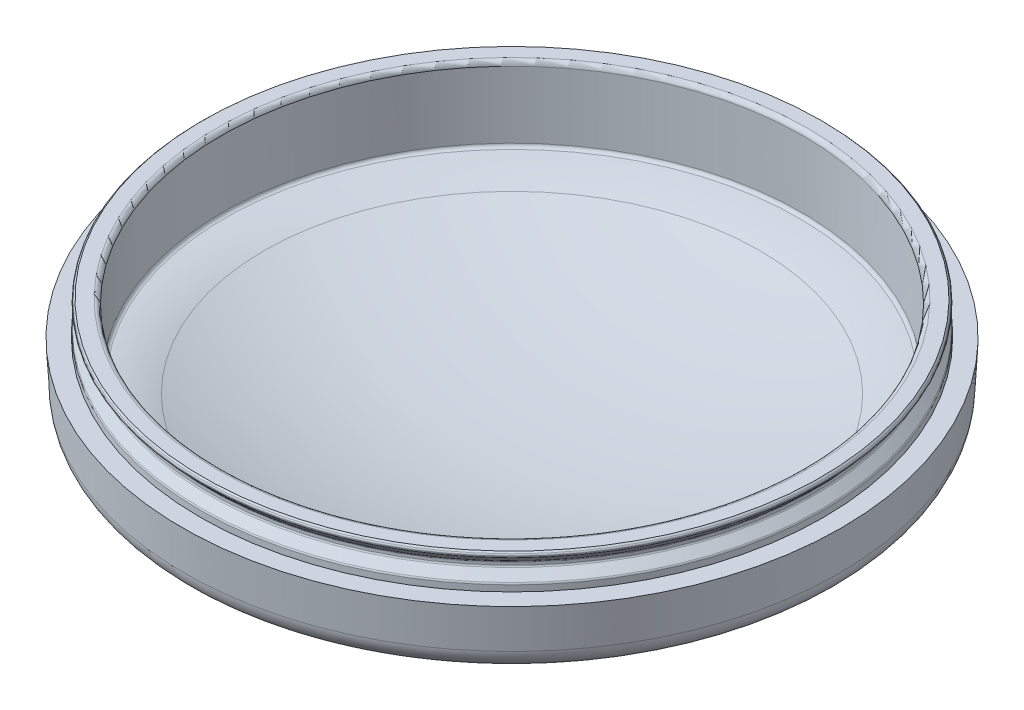
ISO-10303-21;
HEADER;
FILE_DESCRIPTION(('STEP AP214'),'2;1');
FILE_NAME('part.step','',(''),(''),'','','');
FILE_SCHEMA(('AUTOMOTIVE_DESIGN { 1 0 10303 214 1 1 1 1 }'));
ENDSEC;
DATA;
#1=APPLICATION_CONTEXT('core data for automotive mechanical design processes');
#2=APPLICATION_PROTOCOL_DEFINITION('international standard','automotive_design',2000,#1);
#3=PRODUCT_CONTEXT('',#1,'mechanical');
#4=PRODUCT('Part','Part','',(#3));
#5=PRODUCT_RELATED_PRODUCT_CATEGORY('part','',(#4));
#6=PRODUCT_DEFINITION_FORMATION('','',#4);
#7=PRODUCT_DEFINITION_CONTEXT('part definition',#1,'design');
#8=PRODUCT_DEFINITION('design','',#6,#7);
#9=PRODUCT_DEFINITION_SHAPE('','',#8);
#10=(LENGTH_UNIT() NAMED_UNIT(*) SI_UNIT(.MILLI.,.METRE.));
#11=(NAMED_UNIT(*) PLANE_ANGLE_UNIT() SI_UNIT($,.RADIAN.));
#12=(NAMED_UNIT(*) SI_UNIT($,.STERADIAN.) SOLID_ANGLE_UNIT());
#13=UNCERTAINTY_MEASURE_WITH_UNIT(LENGTH_MEASURE(1.E-05),#10,'distance_accuracy_value','');
#14=(GEOMETRIC_REPRESENTATION_CONTEXT(3) GLOBAL_UNCERTAINTY_ASSIGNED_CONTEXT((#13)) GLOBAL_UNIT_ASSIGNED_CONTEXT((#10,
#11,#12)) REPRESENTATION_CONTEXT('',''));
#15=CARTESIAN_POINT('',(0.,0.,0.));
#16=DIRECTION('',(0.,0.,1.));
#17=DIRECTION('',(1.,0.,0.));
#18=AXIS2_PLACEMENT_3D('',#15,#16,#17);
#19=CARTESIAN_POINT('',(0.,0.,0.));
#20=DIRECTION('',(0.,-1.,0.));
#21=DIRECTION('',(1.,0.,0.));
#22=AXIS2_PLACEMENT_3D('',#19,#20,#21);
#23=PLANE('',#22);
#24=CARTESIAN_POINT('',(0.,0.,0.));
#25=DIRECTION('',(0.,-1.,0.));
#26=DIRECTION('',(1.,0.,0.));
#27=AXIS2_PLACEMENT_3D('',#24,#25,#26);
#28=CIRCLE('',#27,13.9150898701436);
#29=CARTESIAN_POINT('',(13.9150898701436,0.,0.));
#30=VERTEX_POINT('',#29);
#31=EDGE_CURVE('E81',#30,#30,#28,.F.);
#32=ORIENTED_EDGE('',*,*,#31,.F.);
#33=EDGE_LOOP('',(#32));
#34=FACE_BOUND('',#33,.T.);
#35=CARTESIAN_POINT('',(0.,0.,0.));
#36=DIRECTION('',(0.,-1.,0.));
#37=DIRECTION('',(1.,0.,0.));
#38=AXIS2_PLACEMENT_3D('',#35,#36,#37);
#39=CIRCLE('',#38,14.71721203);
#40=CARTESIAN_POINT('',(14.71721203,0.,0.));
#41=VERTEX_POINT('',#40);
#42=EDGE_CURVE('E84',#41,#41,#39,.T.);
#43=ORIENTED_EDGE('',*,*,#42,.F.);
#44=EDGE_LOOP('',(#43));
#45=FACE_BOUND('',#44,.T.);
#46=ADVANCED_FACE('F31',(#34,#45),#23,.F.);
#47=CARTESIAN_POINT('',(0.,0.,0.));
#48=DIRECTION('',(0.,1.,0.));
#49=DIRECTION('',(-1.,0.,0.));
#50=AXIS2_PLACEMENT_3D('',#47,#48,#49);
#51=CONICAL_SURFACE('',#50,14.71721203,0.0523598775598355);
#52=CARTESIAN_POINT('',(0.,-1.80397857768988,0.));
#53=DIRECTION('',(0.,-1.,0.));
#54=DIRECTION('',(1.,0.,0.));
#55=AXIS2_PLACEMENT_3D('',#52,#53,#54);
#56=CIRCLE('',#55,14.6226695188691);
#57=CARTESIAN_POINT('',(14.6226695188691,-1.80397857768989,0.));
#58=VERTEX_POINT('',#57);
#59=EDGE_CURVE('E87',#58,#58,#56,.T.);
#60=ORIENTED_EDGE('',*,*,#59,.F.);
#61=EDGE_LOOP('',(#60));
#62=FACE_BOUND('',#61,.T.);
#63=ORIENTED_EDGE('',*,*,#42,.T.);
#64=EDGE_LOOP('',(#63));
#65=FACE_BOUND('',#64,.T.);
#66=ADVANCED_FACE('F120',(#62,#65),#51,.T.);
#67=CARTESIAN_POINT('',(0.,-1.75164262156415,0.));
#68=DIRECTION('',(0.,-1.,0.));
#69=DIRECTION('',(1.,0.,0.));
#70=AXIS2_PLACEMENT_3D('',#67,#68,#69);
#71=TOROIDAL_SURFACE('',#70,13.6240399863513,0.999999997760164);
#72=CARTESIAN_POINT('',(0.,-2.75140795942134,0.));
#73=DIRECTION('',(0.,-1.,0.));
#74=DIRECTION('',(1.,0.,0.));
#75=AXIS2_PLACEMENT_3D('',#72,#73,#74);
#76=CIRCLE('',#75,13.6023774671155);
#77=CARTESIAN_POINT('',(13.6023774671155,-2.75140795942135,0.));
#78=VERTEX_POINT('',#77);
#79=EDGE_CURVE('E90',#78,#78,#76,.T.);
#80=ORIENTED_EDGE('',*,*,#79,.F.);
#81=EDGE_LOOP('',(#80));
#82=FACE_BOUND('',#81,.T.);
#83=ORIENTED_EDGE('',*,*,#59,.T.);
#84=EDGE_LOOP('',(#83));
#85=FACE_BOUND('',#84,.T.);
#86=ADVANCED_FACE('F126',(#82,#85),#71,.T.);
#87=CARTESIAN_POINT('',(0.,-8.75000000000029,0.));
#88=DIRECTION('',(0.,-1.,0.));
#89=DIRECTION('',(1.,0.,0.));
#90=AXIS2_PLACEMENT_3D('',#87,#88,#89);
#91=TOROIDAL_SURFACE('',#90,13.4724023514095,5.99999999999997);
#92=CARTESIAN_POINT('',(0.,-3.11381974614816,0.));
#93=DIRECTION('',(0.,-1.,0.));
#94=DIRECTION('',(1.,0.,0.));
#95=AXIS2_PLACEMENT_3D('',#92,#93,#94);
#96=CIRCLE('',#95,11.414862036838);
#97=CARTESIAN_POINT('',(11.414862036838,-3.11381974614817,0.));
#98=VERTEX_POINT('',#97);
#99=EDGE_CURVE('E93',#98,#98,#96,.T.);
#100=ORIENTED_EDGE('',*,*,#99,.F.);
#101=EDGE_LOOP('',(#100));
#102=FACE_BOUND('',#101,.T.);
#103=ORIENTED_EDGE('',*,*,#79,.T.);
#104=EDGE_LOOP('',(#103));
#105=FACE_BOUND('',#104,.T.);
#106=ADVANCED_FACE('F205',(#102,#105),#91,.F.);
#107=CARTESIAN_POINT('',(0.,28.1546903077457,0.));
#108=DIRECTION('',(0.,-1.,0.));
#109=DIRECTION('',(-1.,0.,0.));
#110=AXIS2_PLACEMENT_3D('',#107,#108,#109);
#111=SPHERICAL_SURFACE('',#110,33.2869162932001);
#112=ORIENTED_EDGE('',*,*,#99,.T.);
#113=EDGE_LOOP('',(#112));
#114=FACE_BOUND('',#113,.T.);
#115=ADVANCED_FACE('F116',(#114),#111,.T.);
#116=CARTESIAN_POINT('',(0.,0.309804838267562,0.));
#117=DIRECTION('',(0.,-1.,0.));
#118=DIRECTION('',(0.,0.,-1.));
#119=AXIS2_PLACEMENT_3D('',#116,#117,#118);
#120=CONICAL_SURFACE('',#119,13.9096822065765,0.0174532925199385);
#121=CARTESIAN_POINT('',(0.,0.268389790703316,0.));
#122=DIRECTION('',(0.,1.,0.));
#123=DIRECTION('',(0.,0.,1.));
#124=AXIS2_PLACEMENT_3D('',#121,#122,#123);
#125=CIRCLE('',#124,13.9104051089208);
#126=CARTESIAN_POINT('',(0.,0.268389790703316,13.9104051089208));
#127=VERTEX_POINT('',#126);
#128=EDGE_CURVE('E10',#127,#127,#125,.F.);
#129=ORIENTED_EDGE('',*,*,#128,.T.);
#130=EDGE_LOOP('',(#129));
#131=FACE_BOUND('',#130,.T.);
#132=ORIENTED_EDGE('',*,*,#31,.T.);
#133=EDGE_LOOP('',(#132));
#134=FACE_BOUND('',#133,.T.);
#135=ADVANCED_FACE('F107',(#131,#134),#120,.T.);
#136=CARTESIAN_POINT('',(-13.,1.5,0.));
#137=DIRECTION('',(0.,-1.,0.));
#138=DIRECTION('',(0.,0.,-1.));
#139=AXIS2_PLACEMENT_3D('',#136,#137,#138);
#140=PLANE('',#139);
#141=CARTESIAN_POINT('',(0.,1.5,0.));
#142=DIRECTION('',(0.,-1.,0.));
#143=DIRECTION('',(0.,0.,-1.));
#144=AXIS2_PLACEMENT_3D('',#141,#142,#143);
#145=CIRCLE('',#144,13.1965394526231);
#146=CARTESIAN_POINT('',(0.,1.5,-13.1965394526231));
#147=VERTEX_POINT('',#146);
#148=EDGE_CURVE('E72',#147,#147,#145,.T.);
#149=ORIENTED_EDGE('',*,*,#148,.T.);
#150=EDGE_LOOP('',(#149));
#151=FACE_BOUND('',#150,.T.);
#152=CARTESIAN_POINT('',(0.,1.5,0.));
#153=DIRECTION('',(0.,-1.,0.));
#154=DIRECTION('',(0.,0.,-1.));
#155=AXIS2_PLACEMENT_3D('',#152,#153,#154);
#156=CIRCLE('',#155,13.8001218624351);
#157=CARTESIAN_POINT('',(0.,1.5,-13.8001218624351));
#158=VERTEX_POINT('',#157);
#159=EDGE_CURVE('E99',#158,#158,#156,.T.);
#160=ORIENTED_EDGE('',*,*,#159,.F.);
#161=EDGE_LOOP('',(#160));
#162=FACE_BOUND('',#161,.T.);
#163=ADVANCED_FACE('F105',(#151,#162),#140,.F.);
#164=CARTESIAN_POINT('',(0.,1.5,0.));
#165=DIRECTION('',(0.,-1.,0.));
#166=DIRECTION('',(0.,0.,-1.));
#167=AXIS2_PLACEMENT_3D('',#164,#165,#166);
#168=CONICAL_SURFACE('',#167,13.8001218624351,0.785398163397447);
#169=CARTESIAN_POINT('',(0.,1.43820627134612,0.));
#170=DIRECTION('',(0.,1.,0.));
#171=DIRECTION('',(0.,0.,1.));
#172=AXIS2_PLACEMENT_3D('',#169,#170,#171);
#173=CIRCLE('',#172,13.861915591089);
#174=CARTESIAN_POINT('',(0.,1.43820627134612,13.861915591089));
#175=VERTEX_POINT('',#174);
#176=EDGE_CURVE('E38',#175,#175,#173,.T.);
#177=ORIENTED_EDGE('',*,*,#176,.T.);
#178=EDGE_LOOP('',(#177));
#179=FACE_BOUND('',#178,.T.);
#180=ORIENTED_EDGE('',*,*,#159,.T.);
#181=EDGE_LOOP('',(#180));
#182=FACE_BOUND('',#181,.T.);
#183=ADVANCED_FACE('F103',(#179,#182),#168,.T.);
#184=CARTESIAN_POINT('',(0.,1.40963730293959,0.));
#185=DIRECTION('',(0.,-1.,0.));
#186=DIRECTION('',(0.,0.,-1.));
#187=AXIS2_PLACEMENT_3D('',#184,#185,#186);
#188=CONICAL_SURFACE('',#187,13.8904845594955,0.0174532925199406);
#189=CARTESIAN_POINT('',(0.,1.36924083387124,0.));
#190=DIRECTION('',(0.,1.,0.));
#191=DIRECTION('',(0.,0.,1.));
#192=AXIS2_PLACEMENT_3D('',#189,#190,#191);
#193=CIRCLE('',#192,13.891189682486);
#194=CARTESIAN_POINT('',(0.,1.36924083387124,13.891189682486));
#195=VERTEX_POINT('',#194);
#196=EDGE_CURVE('E42',#195,#195,#193,.F.);
#197=ORIENTED_EDGE('',*,*,#196,.T.);
#198=EDGE_LOOP('',(#197));
#199=FACE_BOUND('',#198,.T.);
#200=CARTESIAN_POINT('',(0.,1.35106758098802,0.));
#201=DIRECTION('',(0.,1.,0.));
#202=DIRECTION('',(0.,0.,1.));
#203=AXIS2_PLACEMENT_3D('',#200,#201,#202);
#204=CIRCLE('',#203,13.891506897795);
#205=CARTESIAN_POINT('',(0.,1.35106758098802,13.891506897795));
#206=VERTEX_POINT('',#205);
#207=EDGE_CURVE('E46',#206,#206,#204,.T.);
#208=ORIENTED_EDGE('',*,*,#207,.T.);
#209=EDGE_LOOP('',(#208));
#210=FACE_BOUND('',#209,.T.);
#211=ADVANCED_FACE('F114',(#199,#210),#188,.T.);
#212=CARTESIAN_POINT('',(0.,1.30965253342395,0.));
#213=DIRECTION('',(0.,1.,0.));
#214=DIRECTION('',(0.,0.,1.));
#215=AXIS2_PLACEMENT_3D('',#212,#213,#214);
#216=CONICAL_SURFACE('',#215,13.8922298001393,0.767944870877511);
#217=CARTESIAN_POINT('',(0.,0.932528522911992,0.));
#218=DIRECTION('',(0.,1.,0.));
#219=DIRECTION('',(0.,0.,1.));
#220=AXIS2_PLACEMENT_3D('',#217,#218,#219);
#221=CIRCLE('',#220,13.5280453764776);
#222=CARTESIAN_POINT('',(0.,0.932528522911992,13.5280453764776));
#223=VERTEX_POINT('',#222);
#224=EDGE_CURVE('E57',#223,#223,#221,.T.);
#225=ORIENTED_EDGE('',*,*,#224,.T.);
#226=EDGE_LOOP('',(#225));
#227=FACE_BOUND('',#226,.T.);
#228=CARTESIAN_POINT('',(0.,1.27985650329845,0.));
#229=DIRECTION('',(0.,-1.,0.));
#230=DIRECTION('',(0.,0.,-1.));
#231=AXIS2_PLACEMENT_3D('',#228,#229,#230);
#232=CIRCLE('',#231,13.8634561083132);
#233=CARTESIAN_POINT('',(0.,1.27985650329845,-13.8634561083132));
#234=VERTEX_POINT('',#233);
#235=EDGE_CURVE('E60',#234,#234,#232,.T.);
#236=ORIENTED_EDGE('',*,*,#235,.T.);
#237=EDGE_LOOP('',(#236));
#238=FACE_BOUND('',#237,.T.);
#239=ADVANCED_FACE('F164',(#227,#238),#216,.T.);
#240=CARTESIAN_POINT('',(0.,0.902732492786487,0.));
#241=DIRECTION('',(0.,-1.,0.));
#242=DIRECTION('',(0.,0.,-1.));
#243=AXIS2_PLACEMENT_3D('',#240,#241,#242);
#244=CONICAL_SURFACE('',#243,13.4992716846516,0.0174532925199405);
#245=CARTESIAN_POINT('',(0.,0.861317445222362,0.));
#246=DIRECTION('',(0.,-1.,0.));
#247=DIRECTION('',(0.,0.,-1.));
#248=AXIS2_PLACEMENT_3D('',#245,#246,#247);
#249=CIRCLE('',#248,13.4999945869959);
#250=CARTESIAN_POINT('',(0.,0.861317445222362,-13.4999945869959));
#251=VERTEX_POINT('',#250);
#252=EDGE_CURVE('E63',#251,#251,#249,.T.);
#253=ORIENTED_EDGE('',*,*,#252,.T.);
#254=EDGE_LOOP('',(#253));
#255=FACE_BOUND('',#254,.T.);
#256=CARTESIAN_POINT('',(0.,0.744178001319334,0.));
#257=DIRECTION('',(0.,-1.,0.));
#258=DIRECTION('',(0.,0.,-1.));
#259=AXIS2_PLACEMENT_3D('',#256,#257,#258);
#260=CIRCLE('',#259,13.5020392635948);
#261=CARTESIAN_POINT('',(0.,0.744178001319334,-13.5020392635948));
#262=VERTEX_POINT('',#261);
#263=EDGE_CURVE('E66',#262,#262,#260,.F.);
#264=ORIENTED_EDGE('',*,*,#263,.T.);
#265=EDGE_LOOP('',(#264));
#266=FACE_BOUND('',#265,.T.);
#267=ADVANCED_FACE('F166',(#255,#266),#244,.T.);
#268=CARTESIAN_POINT('',(0.,0.702762953755208,0.));
#269=DIRECTION('',(0.,-1.,0.));
#270=DIRECTION('',(0.,0.,-1.));
#271=AXIS2_PLACEMENT_3D('',#268,#269,#270);
#272=CONICAL_SURFACE('',#271,13.5027621659391,0.802851455917387);
#273=CARTESIAN_POINT('',(0.,0.673989261929195,0.));
#274=DIRECTION('',(0.,-1.,0.));
#275=DIRECTION('',(0.,0.,-1.));
#276=AXIS2_PLACEMENT_3D('',#273,#274,#275);
#277=CIRCLE('',#276,13.5325581960646);
#278=CARTESIAN_POINT('',(0.,0.673989261929195,-13.5325581960646));
#279=VERTEX_POINT('',#278);
#280=EDGE_CURVE('E51',#279,#279,#277,.T.);
#281=ORIENTED_EDGE('',*,*,#280,.T.);
#282=EDGE_LOOP('',(#281));
#283=FACE_BOUND('',#282,.T.);
#284=CARTESIAN_POINT('',(0.,0.338578530093574,0.));
#285=DIRECTION('',(0.,1.,0.));
#286=DIRECTION('',(0.,0.,1.));
#287=AXIS2_PLACEMENT_3D('',#284,#285,#286);
#288=CIRCLE('',#287,13.879886176451);
#289=CARTESIAN_POINT('',(0.,0.338578530093574,13.879886176451));
#290=VERTEX_POINT('',#289);
#291=EDGE_CURVE('E54',#290,#290,#288,.T.);
#292=ORIENTED_EDGE('',*,*,#291,.T.);
#293=EDGE_LOOP('',(#292));
#294=FACE_BOUND('',#293,.T.);
#295=ADVANCED_FACE('F173',(#283,#294),#272,.T.);
#296=CARTESIAN_POINT('',(0.,-2.,0.));
#297=DIRECTION('',(0.,1.,0.));
#298=DIRECTION('',(0.,0.,1.));
#299=AXIS2_PLACEMENT_3D('',#296,#297,#298);
#300=CONICAL_SURFACE('',#299,12.9389072727512,0.0174532925199468);
#301=CARTESIAN_POINT('',(0.,1.30349048128742,0.));
#302=DIRECTION('',(0.,-1.,0.));
#303=DIRECTION('',(0.,0.,-1.));
#304=AXIS2_PLACEMENT_3D('',#301,#302,#303);
#305=CIRCLE('',#304,12.9965699135919);
#306=CARTESIAN_POINT('',(0.,1.30349048128742,-12.9965699135919));
#307=VERTEX_POINT('',#306);
#308=EDGE_CURVE('E69',#307,#307,#305,.F.);
#309=ORIENTED_EDGE('',*,*,#308,.T.);
#310=EDGE_LOOP('',(#309));
#311=FACE_BOUND('',#310,.T.);
#312=CARTESIAN_POINT('',(0.,-1.63475020565218,0.));
#313=DIRECTION('',(0.,-1.,0.));
#314=DIRECTION('',(1.,0.,0.));
#315=AXIS2_PLACEMENT_3D('',#312,#313,#314);
#316=CIRCLE('',#315,12.9452827316266);
#317=CARTESIAN_POINT('',(12.9452827316266,-1.63475020565219,0.));
#318=VERTEX_POINT('',#317);
#319=EDGE_CURVE('E75',#318,#318,#316,.T.);
#320=ORIENTED_EDGE('',*,*,#319,.T.);
#321=EDGE_LOOP('',(#320));
#322=FACE_BOUND('',#321,.T.);
#323=ADVANCED_FACE('F180',(#311,#322),#300,.F.);
#324=CARTESIAN_POINT('',(0.,28.1546903077457,0.));
#325=DIRECTION('',(0.,-1.,0.));
#326=DIRECTION('',(-1.,0.,0.));
#327=AXIS2_PLACEMENT_3D('',#324,#325,#326);
#328=SPHERICAL_SURFACE('',#327,32.2869162932001);
#329=CARTESIAN_POINT('',(0.,-2.17445637050612,0.));
#330=DIRECTION('',(0.,-1.,0.));
#331=DIRECTION('',(1.,0.,0.));
#332=AXIS2_PLACEMENT_3D('',#329,#330,#331);
#333=CIRCLE('',#332,11.0719386510761);
#334=CARTESIAN_POINT('',(11.071938651076,-2.17445637050613,0.));
#335=VERTEX_POINT('',#334);
#336=EDGE_CURVE('E96',#335,#335,#333,.T.);
#337=ORIENTED_EDGE('',*,*,#336,.F.);
#338=EDGE_LOOP('',(#337));
#339=FACE_BOUND('',#338,.T.);
#340=ADVANCED_FACE('F184',(#339),#328,.F.);
#341=CARTESIAN_POINT('',(0.,-8.75000000000029,0.));
#342=DIRECTION('',(0.,-1.,0.));
#343=DIRECTION('',(1.,0.,0.));
#344=AXIS2_PLACEMENT_3D('',#341,#342,#343);
#345=TOROIDAL_SURFACE('',#344,13.4724023514095,6.99999999999997);
#346=CARTESIAN_POINT('',(0.,-1.78145823955342,0.));
#347=DIRECTION('',(0.,-1.,0.));
#348=DIRECTION('',(1.,0.,0.));
#349=AXIS2_PLACEMENT_3D('',#346,#347,#348);
#350=CIRCLE('',#349,12.8095104047809);
#351=CARTESIAN_POINT('',(12.8095104047809,-1.78145823955342,0.));
#352=VERTEX_POINT('',#351);
#353=EDGE_CURVE('E78',#352,#352,#350,.F.);
#354=ORIENTED_EDGE('',*,*,#353,.T.);
#355=EDGE_LOOP('',(#354));
#356=FACE_BOUND('',#355,.T.);
#357=ORIENTED_EDGE('',*,*,#336,.T.);
#358=EDGE_LOOP('',(#357));
#359=FACE_BOUND('',#358,.T.);
#360=ADVANCED_FACE('F137',(#356,#359),#345,.T.);
#361=CARTESIAN_POINT('',(0.,-1.63213234468651,0.));
#362=DIRECTION('',(0.,1.,0.));
#363=DIRECTION('',(-1.,0.,0.));
#364=AXIS2_PLACEMENT_3D('',#361,#362,#363);
#365=TOROIDAL_SURFACE('',#364,12.7953055773531,0.15);
#366=ORIENTED_EDGE('',*,*,#319,.F.);
#367=EDGE_LOOP('',(#366));
#368=FACE_BOUND('',#367,.T.);
#369=ORIENTED_EDGE('',*,*,#353,.F.);
#370=EDGE_LOOP('',(#369));
#371=FACE_BOUND('',#370,.T.);
#372=ADVANCED_FACE('F133',(#368,#371),#365,.F.);
#373=CARTESIAN_POINT('',(0.,1.3,0.));
#374=DIRECTION('',(0.,-1.,0.));
#375=DIRECTION('',(0.,0.,-1.));
#376=AXIS2_PLACEMENT_3D('',#373,#374,#375);
#377=TOROIDAL_SURFACE('',#376,13.1965394526231,0.2);
#378=ORIENTED_EDGE('',*,*,#308,.F.);
#379=EDGE_LOOP('',(#378));
#380=FACE_BOUND('',#379,.T.);
#381=ORIENTED_EDGE('',*,*,#148,.F.);
#382=EDGE_LOOP('',(#381));
#383=FACE_BOUND('',#382,.T.);
#384=ADVANCED_FACE('F136',(#380,#383),#377,.T.);
#385=CARTESIAN_POINT('',(0.,0.86306268586609,0.));
#386=DIRECTION('',(0.,-1.,0.));
#387=DIRECTION('',(0.,0.,-1.));
#388=AXIS2_PLACEMENT_3D('',#385,#386,#387);
#389=TOROIDAL_SURFACE('',#388,13.5999793565115,0.1);
#390=ORIENTED_EDGE('',*,*,#224,.F.);
#391=EDGE_LOOP('',(#390));
#392=FACE_BOUND('',#391,.T.);
#393=ORIENTED_EDGE('',*,*,#252,.F.);
#394=EDGE_LOOP('',(#393));
#395=FACE_BOUND('',#394,.T.);
#396=ADVANCED_FACE('F141',(#392,#395),#389,.F.);
#397=CARTESIAN_POINT('',(0.,0.745923241963062,0.));
#398=DIRECTION('',(0.,-1.,0.));
#399=DIRECTION('',(0.,0.,-1.));
#400=AXIS2_PLACEMENT_3D('',#397,#398,#399);
#401=TOROIDAL_SURFACE('',#400,13.6020240331105,0.1);
#402=ORIENTED_EDGE('',*,*,#263,.F.);
#403=EDGE_LOOP('',(#402));
#404=FACE_BOUND('',#403,.T.);
#405=ORIENTED_EDGE('',*,*,#280,.F.);
#406=EDGE_LOOP('',(#405));
#407=FACE_BOUND('',#406,.T.);
#408=ADVANCED_FACE('F145',(#404,#407),#401,.F.);
#409=CARTESIAN_POINT('',(0.,1.36749559322746,0.));
#410=DIRECTION('',(0.,1.,0.));
#411=DIRECTION('',(0.,0.,1.));
#412=AXIS2_PLACEMENT_3D('',#409,#410,#411);
#413=TOROIDAL_SURFACE('',#412,13.7912049129704,0.1);
#414=ORIENTED_EDGE('',*,*,#176,.F.);
#415=EDGE_LOOP('',(#414));
#416=FACE_BOUND('',#415,.T.);
#417=ORIENTED_EDGE('',*,*,#196,.F.);
#418=EDGE_LOOP('',(#417));
#419=FACE_BOUND('',#418,.T.);
#420=ADVANCED_FACE('F149',(#416,#419),#413,.T.);
#421=CARTESIAN_POINT('',(0.,1.34932234034435,0.));
#422=DIRECTION('',(0.,1.,0.));
#423=DIRECTION('',(0.,0.,1.));
#424=AXIS2_PLACEMENT_3D('',#421,#422,#423);
#425=TOROIDAL_SURFACE('',#424,13.7915221282794,0.1);
#426=ORIENTED_EDGE('',*,*,#207,.F.);
#427=EDGE_LOOP('',(#426));
#428=FACE_BOUND('',#427,.T.);
#429=ORIENTED_EDGE('',*,*,#235,.F.);
#430=EDGE_LOOP('',(#429));
#431=FACE_BOUND('',#430,.T.);
#432=ADVANCED_FACE('F152',(#428,#431),#425,.T.);
#433=CARTESIAN_POINT('',(0.,0.266644550059708,0.));
#434=DIRECTION('',(0.,1.,0.));
#435=DIRECTION('',(0.,0.,1.));
#436=AXIS2_PLACEMENT_3D('',#433,#434,#435);
#437=TOROIDAL_SURFACE('',#436,13.8104203394051,0.1);
#438=ORIENTED_EDGE('',*,*,#291,.F.);
#439=EDGE_LOOP('',(#438));
#440=FACE_BOUND('',#439,.T.);
#441=ORIENTED_EDGE('',*,*,#128,.F.);
#442=EDGE_LOOP('',(#441));
#443=FACE_BOUND('',#442,.T.);
#444=ADVANCED_FACE('F33',(#440,#443),#437,.T.);
#445=CLOSED_SHELL('',(#46,#66,#86,#106,#115,#135,#163,#183,#211,#239,#267,#295,#323,#340,#360,
#372,#384,#396,#408,#420,#432,#444));
#446=MANIFOLD_SOLID_BREP('B2',#445);
#447=ADVANCED_BREP_SHAPE_REPRESENTATION('',(#18,#446),#14);
#448=SHAPE_DEFINITION_REPRESENTATION(#9,#447);
ENDSEC;
END-ISO-10303-21;
